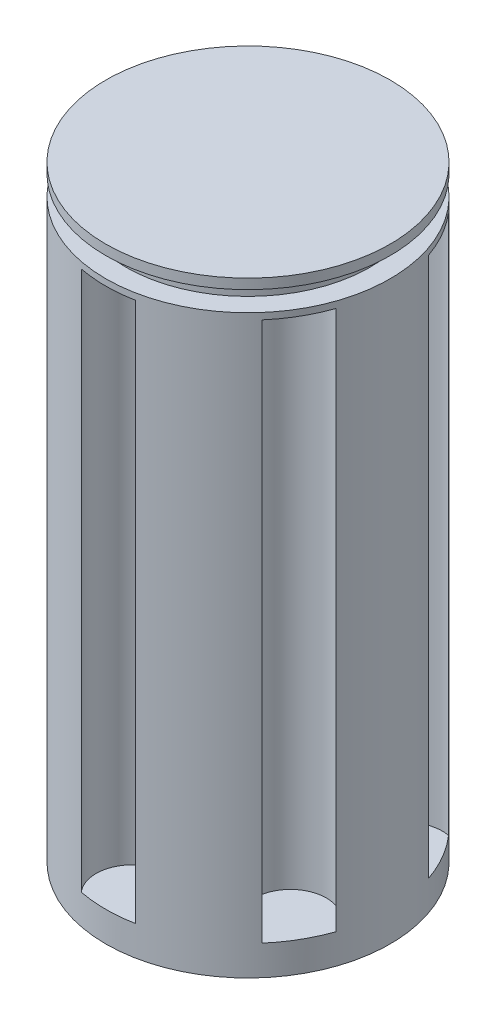
ISO-10303-21;
HEADER;
FILE_DESCRIPTION(('STEP AP214'),'2;1');
FILE_NAME('part.step','',(''),(''),'','','');
FILE_SCHEMA(('AUTOMOTIVE_DESIGN { 1 0 10303 214 1 1 1 1 }'));
ENDSEC;
DATA;
#1=APPLICATION_CONTEXT('core data for automotive mechanical design processes');
#2=APPLICATION_PROTOCOL_DEFINITION('international standard','automotive_design',2000,#1);
#3=PRODUCT_CONTEXT('',#1,'mechanical');
#4=PRODUCT('Part','Part','',(#3));
#5=PRODUCT_RELATED_PRODUCT_CATEGORY('part','',(#4));
#6=PRODUCT_DEFINITION_FORMATION('','',#4);
#7=PRODUCT_DEFINITION_CONTEXT('part definition',#1,'design');
#8=PRODUCT_DEFINITION('design','',#6,#7);
#9=PRODUCT_DEFINITION_SHAPE('','',#8);
#10=(LENGTH_UNIT() NAMED_UNIT(*) SI_UNIT(.MILLI.,.METRE.));
#11=(NAMED_UNIT(*) PLANE_ANGLE_UNIT() SI_UNIT($,.RADIAN.));
#12=(NAMED_UNIT(*) SI_UNIT($,.STERADIAN.) SOLID_ANGLE_UNIT());
#13=UNCERTAINTY_MEASURE_WITH_UNIT(LENGTH_MEASURE(1.E-05),#10,'distance_accuracy_value','');
#14=(GEOMETRIC_REPRESENTATION_CONTEXT(3) GLOBAL_UNCERTAINTY_ASSIGNED_CONTEXT((#13)) GLOBAL_UNIT_ASSIGNED_CONTEXT((#10,
#11,#12)) REPRESENTATION_CONTEXT('',''));
#15=CARTESIAN_POINT('',(0.,0.,0.));
#16=DIRECTION('',(0.,0.,1.));
#17=DIRECTION('',(1.,0.,0.));
#18=AXIS2_PLACEMENT_3D('',#15,#16,#17);
#19=CARTESIAN_POINT('',(0.,150.,0.));
#20=DIRECTION('',(0.,-1.,0.));
#21=DIRECTION('',(0.,0.,-1.));
#22=AXIS2_PLACEMENT_3D('',#19,#20,#21);
#23=CYLINDRICAL_SURFACE('',#22,35.56);
#24=CARTESIAN_POINT('',(0.,144.1,0.));
#25=DIRECTION('',(0.,-1.,0.));
#26=DIRECTION('',(0.,0.,-1.));
#27=AXIS2_PLACEMENT_3D('',#24,#25,#26);
#28=CIRCLE('',#27,35.56);
#29=CARTESIAN_POINT('',(0.,144.1,-35.56));
#30=VERTEX_POINT('',#29);
#31=EDGE_CURVE('E206',#30,#30,#28,.F.);
#32=ORIENTED_EDGE('',*,*,#31,.F.);
#33=EDGE_LOOP('',(#32));
#34=FACE_BOUND('',#33,.T.);
#35=CARTESIAN_POINT('',(0.,142.5,0.));
#36=DIRECTION('',(0.,-1.,0.));
#37=DIRECTION('',(0.,0.,-1.));
#38=AXIS2_PLACEMENT_3D('',#35,#36,#37);
#39=CIRCLE('',#38,35.56);
#40=CARTESIAN_POINT('',(33.6247815740745,142.5,11.5709837134004));
#41=VERTEX_POINT('',#40);
#42=CARTESIAN_POINT('',(26.8331566296185,142.5,23.3344231831507));
#43=VERTEX_POINT('',#42);
#44=EDGE_CURVE('E182',#41,#43,#39,.T.);
#45=ORIENTED_EDGE('',*,*,#44,.F.);
#46=DIRECTION('',(0.,-1.,0.));
#47=VECTOR('',#46,1.);
#48=CARTESIAN_POINT('',(33.6247815740745,75.,11.5709837134004));
#49=LINE('',#48,#47);
#50=CARTESIAN_POINT('',(33.6247815740745,7.5,11.5709837134004));
#51=VERTEX_POINT('',#50);
#52=EDGE_CURVE('E176',#41,#51,#49,.T.);
#53=ORIENTED_EDGE('',*,*,#52,.T.);
#54=CARTESIAN_POINT('',(0.,7.50000000000001,0.));
#55=DIRECTION('',(0.,-1.,0.));
#56=DIRECTION('',(0.,0.,-1.));
#57=AXIS2_PLACEMENT_3D('',#54,#55,#56);
#58=CIRCLE('',#57,35.56);
#59=CARTESIAN_POINT('',(26.8331566296185,7.5,23.3344231831507));
#60=VERTEX_POINT('',#59);
#61=EDGE_CURVE('E173',#51,#60,#58,.T.);
#62=ORIENTED_EDGE('',*,*,#61,.T.);
#63=DIRECTION('',(0.,-1.,0.));
#64=VECTOR('',#63,1.);
#65=CARTESIAN_POINT('',(26.8331566296184,75.,23.3344231831507));
#66=LINE('',#65,#64);
#67=EDGE_CURVE('E179',#60,#43,#66,.F.);
#68=ORIENTED_EDGE('',*,*,#67,.T.);
#69=EDGE_LOOP('',(#45,#53,#62,#68));
#70=FACE_BOUND('',#69,.T.);
#71=CARTESIAN_POINT('',(0.,142.5,0.));
#72=DIRECTION('',(0.,-1.,0.));
#73=DIRECTION('',(0.,0.,-1.));
#74=AXIS2_PLACEMENT_3D('',#71,#72,#73);
#75=CIRCLE('',#74,35.56);
#76=CARTESIAN_POINT('',(-26.8331566296181,142.5,23.3344231831511));
#77=VERTEX_POINT('',#76);
#78=CARTESIAN_POINT('',(-33.6247815740744,142.5,11.5709837134009));
#79=VERTEX_POINT('',#78);
#80=EDGE_CURVE('E160',#77,#79,#75,.T.);
#81=ORIENTED_EDGE('',*,*,#80,.F.);
#82=DIRECTION('',(0.,-1.,0.));
#83=VECTOR('',#82,1.);
#84=CARTESIAN_POINT('',(-26.8331566296181,75.,23.3344231831511));
#85=LINE('',#84,#83);
#86=CARTESIAN_POINT('',(-26.8331566296181,7.5,23.3344231831511));
#87=VERTEX_POINT('',#86);
#88=EDGE_CURVE('E154',#77,#87,#85,.T.);
#89=ORIENTED_EDGE('',*,*,#88,.T.);
#90=CARTESIAN_POINT('',(0.,7.50000000000001,0.));
#91=DIRECTION('',(0.,-1.,0.));
#92=DIRECTION('',(0.,0.,-1.));
#93=AXIS2_PLACEMENT_3D('',#90,#91,#92);
#94=CIRCLE('',#93,35.56);
#95=CARTESIAN_POINT('',(-33.6247815740744,7.5,11.5709837134009));
#96=VERTEX_POINT('',#95);
#97=EDGE_CURVE('E151',#87,#96,#94,.T.);
#98=ORIENTED_EDGE('',*,*,#97,.T.);
#99=DIRECTION('',(0.,-1.,0.));
#100=VECTOR('',#99,1.);
#101=CARTESIAN_POINT('',(-33.6247815740744,75.,11.5709837134009));
#102=LINE('',#101,#100);
#103=EDGE_CURVE('E157',#96,#79,#102,.F.);
#104=ORIENTED_EDGE('',*,*,#103,.T.);
#105=EDGE_LOOP('',(#81,#89,#98,#104));
#106=FACE_BOUND('',#105,.T.);
#107=CARTESIAN_POINT('',(0.,142.5,0.));
#108=DIRECTION('',(0.,-1.,0.));
#109=DIRECTION('',(0.,0.,-1.));
#110=AXIS2_PLACEMENT_3D('',#107,#108,#109);
#111=CIRCLE('',#110,35.56);
#112=CARTESIAN_POINT('',(-6.79162494445618,142.5,-34.9054068965517));
#113=VERTEX_POINT('',#112);
#114=CARTESIAN_POINT('',(6.79162494445618,142.5,-34.9054068965517));
#115=VERTEX_POINT('',#114);
#116=EDGE_CURVE('E133',#113,#115,#111,.T.);
#117=ORIENTED_EDGE('',*,*,#116,.F.);
#118=DIRECTION('',(0.,-1.,0.));
#119=VECTOR('',#118,1.);
#120=CARTESIAN_POINT('',(-6.79162494445619,75.,-34.9054068965517));
#121=LINE('',#120,#119);
#122=CARTESIAN_POINT('',(-6.79162494445618,7.5,-34.9054068965517));
#123=VERTEX_POINT('',#122);
#124=EDGE_CURVE('E223',#113,#123,#121,.T.);
#125=ORIENTED_EDGE('',*,*,#124,.T.);
#126=CARTESIAN_POINT('',(0.,7.50000000000001,0.));
#127=DIRECTION('',(0.,-1.,0.));
#128=DIRECTION('',(0.,0.,-1.));
#129=AXIS2_PLACEMENT_3D('',#126,#127,#128);
#130=CIRCLE('',#129,35.56);
#131=CARTESIAN_POINT('',(6.79162494445618,7.5,-34.9054068965517));
#132=VERTEX_POINT('',#131);
#133=EDGE_CURVE('E220',#123,#132,#130,.T.);
#134=ORIENTED_EDGE('',*,*,#133,.T.);
#135=DIRECTION('',(0.,-1.,0.));
#136=VECTOR('',#135,1.);
#137=CARTESIAN_POINT('',(6.79162494445619,75.,-34.9054068965517));
#138=LINE('',#137,#136);
#139=EDGE_CURVE('E226',#132,#115,#138,.F.);
#140=ORIENTED_EDGE('',*,*,#139,.T.);
#141=EDGE_LOOP('',(#117,#125,#134,#140));
#142=FACE_BOUND('',#141,.T.);
#143=CARTESIAN_POINT('',(0.,0.,0.));
#144=DIRECTION('',(0.,1.,0.));
#145=DIRECTION('',(0.,0.,-1.));
#146=AXIS2_PLACEMENT_3D('',#143,#144,#145);
#147=CIRCLE('',#146,35.56);
#148=CARTESIAN_POINT('',(0.,0.,-35.56));
#149=VERTEX_POINT('',#148);
#150=EDGE_CURVE('E215',#149,#149,#147,.T.);
#151=ORIENTED_EDGE('',*,*,#150,.T.);
#152=EDGE_LOOP('',(#151));
#153=FACE_BOUND('',#152,.T.);
#154=CARTESIAN_POINT('',(0.,142.5,0.));
#155=DIRECTION('',(0.,-1.,0.));
#156=DIRECTION('',(0.,0.,-1.));
#157=AXIS2_PLACEMENT_3D('',#154,#155,#156);
#158=CIRCLE('',#157,35.56);
#159=CARTESIAN_POINT('',(-33.6247815740744,142.5,-11.5709837134006));
#160=VERTEX_POINT('',#159);
#161=CARTESIAN_POINT('',(-26.8331566296183,142.5,-23.3344231831509));
#162=VERTEX_POINT('',#161);
#163=EDGE_CURVE('E145',#160,#162,#158,.T.);
#164=ORIENTED_EDGE('',*,*,#163,.F.);
#165=DIRECTION('',(0.,-1.,0.));
#166=VECTOR('',#165,1.);
#167=CARTESIAN_POINT('',(-33.6247815740744,75.,-11.5709837134006));
#168=LINE('',#167,#166);
#169=CARTESIAN_POINT('',(-33.6247815740744,7.5,-11.5709837134006));
#170=VERTEX_POINT('',#169);
#171=EDGE_CURVE('E132',#160,#170,#168,.T.);
#172=ORIENTED_EDGE('',*,*,#171,.T.);
#173=CARTESIAN_POINT('',(0.,7.50000000000001,0.));
#174=DIRECTION('',(0.,-1.,0.));
#175=DIRECTION('',(0.,0.,-1.));
#176=AXIS2_PLACEMENT_3D('',#173,#174,#175);
#177=CIRCLE('',#176,35.56);
#178=CARTESIAN_POINT('',(-26.8331566296183,7.5,-23.3344231831509));
#179=VERTEX_POINT('',#178);
#180=EDGE_CURVE('E124',#170,#179,#177,.T.);
#181=ORIENTED_EDGE('',*,*,#180,.T.);
#182=DIRECTION('',(0.,-1.,0.));
#183=VECTOR('',#182,1.);
#184=CARTESIAN_POINT('',(-26.8331566296183,75.,-23.3344231831509));
#185=LINE('',#184,#183);
#186=EDGE_CURVE('E139',#179,#162,#185,.F.);
#187=ORIENTED_EDGE('',*,*,#186,.T.);
#188=EDGE_LOOP('',(#164,#172,#181,#187));
#189=FACE_BOUND('',#188,.T.);
#190=CARTESIAN_POINT('',(0.,142.5,0.));
#191=DIRECTION('',(0.,-1.,0.));
#192=DIRECTION('',(0.,0.,-1.));
#193=AXIS2_PLACEMENT_3D('',#190,#191,#192);
#194=CIRCLE('',#193,35.56);
#195=CARTESIAN_POINT('',(6.79162494445618,142.5,34.9054068965517));
#196=VERTEX_POINT('',#195);
#197=CARTESIAN_POINT('',(-6.79162494445618,142.5,34.9054068965517));
#198=VERTEX_POINT('',#197);
#199=EDGE_CURVE('E171',#196,#198,#194,.T.);
#200=ORIENTED_EDGE('',*,*,#199,.F.);
#201=DIRECTION('',(0.,-1.,0.));
#202=VECTOR('',#201,1.);
#203=CARTESIAN_POINT('',(6.79162494445619,75.,34.9054068965517));
#204=LINE('',#203,#202);
#205=CARTESIAN_POINT('',(6.79162494445618,7.5,34.9054068965517));
#206=VERTEX_POINT('',#205);
#207=EDGE_CURVE('E165',#196,#206,#204,.T.);
#208=ORIENTED_EDGE('',*,*,#207,.T.);
#209=CARTESIAN_POINT('',(0.,7.50000000000001,0.));
#210=DIRECTION('',(0.,-1.,0.));
#211=DIRECTION('',(0.,0.,-1.));
#212=AXIS2_PLACEMENT_3D('',#209,#210,#211);
#213=CIRCLE('',#212,35.56);
#214=CARTESIAN_POINT('',(-6.79162494445618,7.5,34.9054068965517));
#215=VERTEX_POINT('',#214);
#216=EDGE_CURVE('E162',#206,#215,#213,.T.);
#217=ORIENTED_EDGE('',*,*,#216,.T.);
#218=DIRECTION('',(0.,-1.,0.));
#219=VECTOR('',#218,1.);
#220=CARTESIAN_POINT('',(-6.79162494445619,75.,34.9054068965517));
#221=LINE('',#220,#219);
#222=EDGE_CURVE('E168',#215,#198,#221,.F.);
#223=ORIENTED_EDGE('',*,*,#222,.T.);
#224=EDGE_LOOP('',(#200,#208,#217,#223));
#225=FACE_BOUND('',#224,.T.);
#226=CARTESIAN_POINT('',(0.,142.5,0.));
#227=DIRECTION('',(0.,-1.,0.));
#228=DIRECTION('',(0.,0.,-1.));
#229=AXIS2_PLACEMENT_3D('',#226,#227,#228);
#230=CIRCLE('',#229,35.56);
#231=CARTESIAN_POINT('',(26.833156629618,142.5,-23.3344231831513));
#232=VERTEX_POINT('',#231);
#233=CARTESIAN_POINT('',(33.6247815740743,142.5,-11.5709837134011));
#234=VERTEX_POINT('',#233);
#235=EDGE_CURVE('E43',#232,#234,#230,.T.);
#236=ORIENTED_EDGE('',*,*,#235,.F.);
#237=DIRECTION('',(0.,-1.,0.));
#238=VECTOR('',#237,1.);
#239=CARTESIAN_POINT('',(26.833156629618,75.,-23.3344231831513));
#240=LINE('',#239,#238);
#241=CARTESIAN_POINT('',(26.833156629618,7.5,-23.3344231831513));
#242=VERTEX_POINT('',#241);
#243=EDGE_CURVE('E187',#232,#242,#240,.T.);
#244=ORIENTED_EDGE('',*,*,#243,.T.);
#245=CARTESIAN_POINT('',(0.,7.50000000000001,0.));
#246=DIRECTION('',(0.,-1.,0.));
#247=DIRECTION('',(0.,0.,-1.));
#248=AXIS2_PLACEMENT_3D('',#245,#246,#247);
#249=CIRCLE('',#248,35.56);
#250=CARTESIAN_POINT('',(33.6247815740743,7.5,-11.5709837134011));
#251=VERTEX_POINT('',#250);
#252=EDGE_CURVE('E184',#242,#251,#249,.T.);
#253=ORIENTED_EDGE('',*,*,#252,.T.);
#254=DIRECTION('',(0.,-1.,0.));
#255=VECTOR('',#254,1.);
#256=CARTESIAN_POINT('',(33.6247815740743,75.,-11.5709837134011));
#257=LINE('',#256,#255);
#258=EDGE_CURVE('E190',#251,#234,#257,.F.);
#259=ORIENTED_EDGE('',*,*,#258,.T.);
#260=EDGE_LOOP('',(#236,#244,#253,#259));
#261=FACE_BOUND('',#260,.T.);
#262=ADVANCED_FACE('F35',(#34,#70,#106,#142,#153,#189,#225,#261),#23,.T.);
#263=CARTESIAN_POINT('',(0.,0.,0.));
#264=DIRECTION('',(0.,1.,0.));
#265=DIRECTION('',(0.,0.,1.));
#266=AXIS2_PLACEMENT_3D('',#263,#264,#265);
#267=PLANE('',#266);
#268=CARTESIAN_POINT('',(0.,0.,0.));
#269=DIRECTION('',(0.,-1.,0.));
#270=DIRECTION('',(0.,0.,-1.));
#271=AXIS2_PLACEMENT_3D('',#268,#269,#270);
#272=CIRCLE('',#271,19.05);
#273=CARTESIAN_POINT('',(0.,0.,-19.05));
#274=VERTEX_POINT('',#273);
#275=EDGE_CURVE('E203',#274,#274,#272,.T.);
#276=ORIENTED_EDGE('',*,*,#275,.F.);
#277=EDGE_LOOP('',(#276));
#278=FACE_BOUND('',#277,.T.);
#279=ORIENTED_EDGE('',*,*,#150,.F.);
#280=EDGE_LOOP('',(#279));
#281=FACE_BOUND('',#280,.T.);
#282=ADVANCED_FACE('F250',(#278,#281),#267,.F.);
#283=CARTESIAN_POINT('',(0.,142.5,-29.));
#284=DIRECTION('',(0.,-1.,0.));
#285=DIRECTION('',(0.,0.,-1.));
#286=AXIS2_PLACEMENT_3D('',#283,#284,#285);
#287=CYLINDRICAL_SURFACE('',#286,9.);
#288=CARTESIAN_POINT('',(0.,7.5,-29.));
#289=DIRECTION('',(0.,-1.,0.));
#290=DIRECTION('',(0.,0.,-1.));
#291=AXIS2_PLACEMENT_3D('',#288,#289,#290);
#292=CIRCLE('',#291,9.);
#293=EDGE_CURVE('E210',#132,#123,#292,.T.);
#294=ORIENTED_EDGE('',*,*,#293,.T.);
#295=ORIENTED_EDGE('',*,*,#124,.F.);
#296=CARTESIAN_POINT('',(0.,142.5,-29.));
#297=DIRECTION('',(0.,-1.,0.));
#298=DIRECTION('',(0.,0.,-1.));
#299=AXIS2_PLACEMENT_3D('',#296,#297,#298);
#300=CIRCLE('',#299,9.);
#301=EDGE_CURVE('E212',#115,#113,#300,.T.);
#302=ORIENTED_EDGE('',*,*,#301,.F.);
#303=ORIENTED_EDGE('',*,*,#139,.F.);
#304=EDGE_LOOP('',(#294,#295,#302,#303));
#305=FACE_BOUND('',#304,.T.);
#306=ADVANCED_FACE('F235',(#305),#287,.F.);
#307=CARTESIAN_POINT('',(0.,142.5,-29.));
#308=DIRECTION('',(0.,-1.,0.));
#309=DIRECTION('',(0.,0.,-1.));
#310=AXIS2_PLACEMENT_3D('',#307,#308,#309);
#311=PLANE('',#310);
#312=ORIENTED_EDGE('',*,*,#116,.T.);
#313=ORIENTED_EDGE('',*,*,#301,.T.);
#314=EDGE_LOOP('',(#312,#313));
#315=FACE_BOUND('',#314,.T.);
#316=ADVANCED_FACE('F231',(#315),#311,.T.);
#317=CARTESIAN_POINT('',(0.,7.5,-29.));
#318=DIRECTION('',(0.,-1.,0.));
#319=DIRECTION('',(0.,0.,-1.));
#320=AXIS2_PLACEMENT_3D('',#317,#318,#319);
#321=PLANE('',#320);
#322=ORIENTED_EDGE('',*,*,#293,.F.);
#323=ORIENTED_EDGE('',*,*,#133,.F.);
#324=EDGE_LOOP('',(#322,#323));
#325=FACE_BOUND('',#324,.T.);
#326=ADVANCED_FACE('F238',(#325),#321,.F.);
#327=CARTESIAN_POINT('',(-25.1147367097488,142.5,-14.4999999999999));
#328=DIRECTION('',(0.,-1.,0.));
#329=DIRECTION('',(0.,0.,-1.));
#330=AXIS2_PLACEMENT_3D('',#327,#328,#329);
#331=CYLINDRICAL_SURFACE('',#330,9.);
#332=CARTESIAN_POINT('',(-25.1147367097488,7.5,-14.4999999999999));
#333=DIRECTION('',(0.,-1.,0.));
#334=DIRECTION('',(-0.86602540378444,0.,-0.499999999999998));
#335=AXIS2_PLACEMENT_3D('',#332,#333,#334);
#336=CIRCLE('',#335,9.);
#337=EDGE_CURVE('E127',#179,#170,#336,.T.);
#338=ORIENTED_EDGE('',*,*,#337,.T.);
#339=ORIENTED_EDGE('',*,*,#171,.F.);
#340=CARTESIAN_POINT('',(-25.1147367097488,142.5,-14.4999999999999));
#341=DIRECTION('',(0.,-1.,0.));
#342=DIRECTION('',(-0.86602540378444,0.,-0.499999999999998));
#343=AXIS2_PLACEMENT_3D('',#340,#341,#342);
#344=CIRCLE('',#343,9.);
#345=EDGE_CURVE('E140',#162,#160,#344,.T.);
#346=ORIENTED_EDGE('',*,*,#345,.F.);
#347=ORIENTED_EDGE('',*,*,#186,.F.);
#348=EDGE_LOOP('',(#338,#339,#346,#347));
#349=FACE_BOUND('',#348,.T.);
#350=ADVANCED_FACE('F136',(#349),#331,.F.);
#351=CARTESIAN_POINT('',(-25.1147367097488,142.5,-14.4999999999999));
#352=DIRECTION('',(0.,-1.,0.));
#353=DIRECTION('',(-0.86602540378444,0.,-0.499999999999998));
#354=AXIS2_PLACEMENT_3D('',#351,#352,#353);
#355=PLANE('',#354);
#356=ORIENTED_EDGE('',*,*,#163,.T.);
#357=ORIENTED_EDGE('',*,*,#345,.T.);
#358=EDGE_LOOP('',(#356,#357));
#359=FACE_BOUND('',#358,.T.);
#360=ADVANCED_FACE('F245',(#359),#355,.T.);
#361=CARTESIAN_POINT('',(-25.1147367097488,7.5,-14.4999999999999));
#362=DIRECTION('',(0.,-1.,0.));
#363=DIRECTION('',(-0.86602540378444,0.,-0.499999999999998));
#364=AXIS2_PLACEMENT_3D('',#361,#362,#363);
#365=PLANE('',#364);
#366=ORIENTED_EDGE('',*,*,#337,.F.);
#367=ORIENTED_EDGE('',*,*,#180,.F.);
#368=EDGE_LOOP('',(#366,#367));
#369=FACE_BOUND('',#368,.T.);
#370=ADVANCED_FACE('F126',(#369),#365,.F.);
#371=CARTESIAN_POINT('',(-25.1147367097487,142.5,14.5000000000001));
#372=DIRECTION('',(0.,-1.,0.));
#373=DIRECTION('',(0.,0.,-1.));
#374=AXIS2_PLACEMENT_3D('',#371,#372,#373);
#375=CYLINDRICAL_SURFACE('',#374,9.);
#376=CARTESIAN_POINT('',(-25.1147367097487,7.5,14.5000000000001));
#377=DIRECTION('',(0.,-1.,0.));
#378=DIRECTION('',(-0.866025403784436,0.,0.500000000000004));
#379=AXIS2_PLACEMENT_3D('',#376,#377,#378);
#380=CIRCLE('',#379,9.);
#381=EDGE_CURVE('E270',#96,#87,#380,.T.);
#382=ORIENTED_EDGE('',*,*,#381,.T.);
#383=ORIENTED_EDGE('',*,*,#88,.F.);
#384=CARTESIAN_POINT('',(-25.1147367097487,142.5,14.5000000000001));
#385=DIRECTION('',(0.,-1.,0.));
#386=DIRECTION('',(-0.866025403784436,0.,0.500000000000004));
#387=AXIS2_PLACEMENT_3D('',#384,#385,#386);
#388=CIRCLE('',#387,9.);
#389=EDGE_CURVE('E141',#79,#77,#388,.T.);
#390=ORIENTED_EDGE('',*,*,#389,.F.);
#391=ORIENTED_EDGE('',*,*,#103,.F.);
#392=EDGE_LOOP('',(#382,#383,#390,#391));
#393=FACE_BOUND('',#392,.T.);
#394=ADVANCED_FACE('F269',(#393),#375,.F.);
#395=CARTESIAN_POINT('',(-25.1147367097487,142.5,14.5000000000001));
#396=DIRECTION('',(0.,-1.,0.));
#397=DIRECTION('',(-0.866025403784436,0.,0.500000000000004));
#398=AXIS2_PLACEMENT_3D('',#395,#396,#397);
#399=PLANE('',#398);
#400=ORIENTED_EDGE('',*,*,#80,.T.);
#401=ORIENTED_EDGE('',*,*,#389,.T.);
#402=EDGE_LOOP('',(#400,#401));
#403=FACE_BOUND('',#402,.T.);
#404=ADVANCED_FACE('F266',(#403),#399,.T.);
#405=CARTESIAN_POINT('',(-25.1147367097487,7.5,14.5000000000001));
#406=DIRECTION('',(0.,-1.,0.));
#407=DIRECTION('',(-0.866025403784436,0.,0.500000000000004));
#408=AXIS2_PLACEMENT_3D('',#405,#406,#407);
#409=PLANE('',#408);
#410=ORIENTED_EDGE('',*,*,#381,.F.);
#411=ORIENTED_EDGE('',*,*,#97,.F.);
#412=EDGE_LOOP('',(#410,#411));
#413=FACE_BOUND('',#412,.T.);
#414=ADVANCED_FACE('F318',(#413),#409,.F.);
#415=CARTESIAN_POINT('',(0.,142.5,29.));
#416=DIRECTION('',(0.,-1.,0.));
#417=DIRECTION('',(0.,0.,-1.));
#418=AXIS2_PLACEMENT_3D('',#415,#416,#417);
#419=CYLINDRICAL_SURFACE('',#418,9.);
#420=CARTESIAN_POINT('',(0.,7.5,29.));
#421=DIRECTION('',(0.,-1.,0.));
#422=DIRECTION('',(0.,0.,1.));
#423=AXIS2_PLACEMENT_3D('',#420,#421,#422);
#424=CIRCLE('',#423,9.);
#425=EDGE_CURVE('E278',#215,#206,#424,.T.);
#426=ORIENTED_EDGE('',*,*,#425,.T.);
#427=ORIENTED_EDGE('',*,*,#207,.F.);
#428=CARTESIAN_POINT('',(0.,142.5,29.));
#429=DIRECTION('',(0.,-1.,0.));
#430=DIRECTION('',(0.,0.,1.));
#431=AXIS2_PLACEMENT_3D('',#428,#429,#430);
#432=CIRCLE('',#431,9.);
#433=EDGE_CURVE('E272',#198,#196,#432,.T.);
#434=ORIENTED_EDGE('',*,*,#433,.F.);
#435=ORIENTED_EDGE('',*,*,#222,.F.);
#436=EDGE_LOOP('',(#426,#427,#434,#435));
#437=FACE_BOUND('',#436,.T.);
#438=ADVANCED_FACE('F325',(#437),#419,.F.);
#439=CARTESIAN_POINT('',(0.,142.5,29.));
#440=DIRECTION('',(0.,-1.,0.));
#441=DIRECTION('',(0.,0.,1.));
#442=AXIS2_PLACEMENT_3D('',#439,#440,#441);
#443=PLANE('',#442);
#444=ORIENTED_EDGE('',*,*,#199,.T.);
#445=ORIENTED_EDGE('',*,*,#433,.T.);
#446=EDGE_LOOP('',(#444,#445));
#447=FACE_BOUND('',#446,.T.);
#448=ADVANCED_FACE('F322',(#447),#443,.T.);
#449=CARTESIAN_POINT('',(0.,7.5,29.));
#450=DIRECTION('',(0.,-1.,0.));
#451=DIRECTION('',(0.,0.,1.));
#452=AXIS2_PLACEMENT_3D('',#449,#450,#451);
#453=PLANE('',#452);
#454=ORIENTED_EDGE('',*,*,#425,.F.);
#455=ORIENTED_EDGE('',*,*,#216,.F.);
#456=EDGE_LOOP('',(#454,#455));
#457=FACE_BOUND('',#456,.T.);
#458=ADVANCED_FACE('F301',(#457),#453,.F.);
#459=CARTESIAN_POINT('',(25.1147367097489,142.5,14.4999999999998));
#460=DIRECTION('',(0.,-1.,0.));
#461=DIRECTION('',(0.,0.,-1.));
#462=AXIS2_PLACEMENT_3D('',#459,#460,#461);
#463=CYLINDRICAL_SURFACE('',#462,9.);
#464=CARTESIAN_POINT('',(25.1147367097489,7.5,14.4999999999998));
#465=DIRECTION('',(0.,-1.,0.));
#466=DIRECTION('',(0.866025403784443,0.,0.499999999999992));
#467=AXIS2_PLACEMENT_3D('',#464,#465,#466);
#468=CIRCLE('',#467,9.);
#469=EDGE_CURVE('E57',#60,#51,#468,.T.);
#470=ORIENTED_EDGE('',*,*,#469,.T.);
#471=ORIENTED_EDGE('',*,*,#52,.F.);
#472=CARTESIAN_POINT('',(25.1147367097489,142.5,14.4999999999998));
#473=DIRECTION('',(0.,-1.,0.));
#474=DIRECTION('',(0.866025403784443,0.,0.499999999999992));
#475=AXIS2_PLACEMENT_3D('',#472,#473,#474);
#476=CIRCLE('',#475,9.);
#477=EDGE_CURVE('E281',#43,#41,#476,.T.);
#478=ORIENTED_EDGE('',*,*,#477,.F.);
#479=ORIENTED_EDGE('',*,*,#67,.F.);
#480=EDGE_LOOP('',(#470,#471,#478,#479));
#481=FACE_BOUND('',#480,.T.);
#482=ADVANCED_FACE('F284',(#481),#463,.F.);
#483=CARTESIAN_POINT('',(25.1147367097489,142.5,14.4999999999998));
#484=DIRECTION('',(0.,-1.,0.));
#485=DIRECTION('',(0.866025403784443,0.,0.499999999999992));
#486=AXIS2_PLACEMENT_3D('',#483,#484,#485);
#487=PLANE('',#486);
#488=ORIENTED_EDGE('',*,*,#44,.T.);
#489=ORIENTED_EDGE('',*,*,#477,.T.);
#490=EDGE_LOOP('',(#488,#489));
#491=FACE_BOUND('',#490,.T.);
#492=ADVANCED_FACE('F288',(#491),#487,.T.);
#493=CARTESIAN_POINT('',(25.1147367097489,7.5,14.4999999999998));
#494=DIRECTION('',(0.,-1.,0.));
#495=DIRECTION('',(0.866025403784443,0.,0.499999999999992));
#496=AXIS2_PLACEMENT_3D('',#493,#494,#495);
#497=PLANE('',#496);
#498=ORIENTED_EDGE('',*,*,#469,.F.);
#499=ORIENTED_EDGE('',*,*,#61,.F.);
#500=EDGE_LOOP('',(#498,#499));
#501=FACE_BOUND('',#500,.T.);
#502=ADVANCED_FACE('F286',(#501),#497,.F.);
#503=CARTESIAN_POINT('',(25.1147367097485,142.5,-14.5000000000003));
#504=DIRECTION('',(0.,-1.,0.));
#505=DIRECTION('',(0.,0.,-1.));
#506=AXIS2_PLACEMENT_3D('',#503,#504,#505);
#507=CYLINDRICAL_SURFACE('',#506,9.);
#508=CARTESIAN_POINT('',(25.1147367097485,7.5,-14.5000000000003));
#509=DIRECTION('',(0.,-1.,0.));
#510=DIRECTION('',(0.866025403784433,0.,-0.50000000000001));
#511=AXIS2_PLACEMENT_3D('',#508,#509,#510);
#512=CIRCLE('',#511,9.);
#513=EDGE_CURVE('E50',#251,#242,#512,.T.);
#514=ORIENTED_EDGE('',*,*,#513,.T.);
#515=ORIENTED_EDGE('',*,*,#243,.F.);
#516=CARTESIAN_POINT('',(25.1147367097485,142.5,-14.5000000000003));
#517=DIRECTION('',(0.,-1.,0.));
#518=DIRECTION('',(0.866025403784433,0.,-0.50000000000001));
#519=AXIS2_PLACEMENT_3D('',#516,#517,#518);
#520=CIRCLE('',#519,9.);
#521=EDGE_CURVE('E197',#234,#232,#520,.T.);
#522=ORIENTED_EDGE('',*,*,#521,.F.);
#523=ORIENTED_EDGE('',*,*,#258,.F.);
#524=EDGE_LOOP('',(#514,#515,#522,#523));
#525=FACE_BOUND('',#524,.T.);
#526=ADVANCED_FACE('F200',(#525),#507,.F.);
#527=CARTESIAN_POINT('',(25.1147367097485,142.5,-14.5000000000003));
#528=DIRECTION('',(0.,-1.,0.));
#529=DIRECTION('',(0.866025403784433,0.,-0.50000000000001));
#530=AXIS2_PLACEMENT_3D('',#527,#528,#529);
#531=PLANE('',#530);
#532=ORIENTED_EDGE('',*,*,#235,.T.);
#533=ORIENTED_EDGE('',*,*,#521,.T.);
#534=EDGE_LOOP('',(#532,#533));
#535=FACE_BOUND('',#534,.T.);
#536=ADVANCED_FACE('F196',(#535),#531,.T.);
#537=CARTESIAN_POINT('',(25.1147367097485,7.5,-14.5000000000003));
#538=DIRECTION('',(0.,-1.,0.));
#539=DIRECTION('',(0.866025403784433,0.,-0.50000000000001));
#540=AXIS2_PLACEMENT_3D('',#537,#538,#539);
#541=PLANE('',#540);
#542=ORIENTED_EDGE('',*,*,#513,.F.);
#543=ORIENTED_EDGE('',*,*,#252,.F.);
#544=EDGE_LOOP('',(#542,#543));
#545=FACE_BOUND('',#544,.T.);
#546=ADVANCED_FACE('F202',(#545),#541,.F.);
#547=CARTESIAN_POINT('',(0.,150.,0.));
#548=DIRECTION('',(0.,-1.,0.));
#549=DIRECTION('',(0.,0.,-1.));
#550=AXIS2_PLACEMENT_3D('',#547,#548,#549);
#551=CYLINDRICAL_SURFACE('',#550,19.05);
#552=CARTESIAN_POINT('',(0.,144.1,0.));
#553=DIRECTION('',(0.,-1.,0.));
#554=DIRECTION('',(0.,0.,-1.));
#555=AXIS2_PLACEMENT_3D('',#552,#553,#554);
#556=CIRCLE('',#555,19.05);
#557=CARTESIAN_POINT('',(0.,144.1,-19.05));
#558=VERTEX_POINT('',#557);
#559=EDGE_CURVE('E38',#558,#558,#556,.F.);
#560=ORIENTED_EDGE('',*,*,#559,.T.);
#561=EDGE_LOOP('',(#560));
#562=FACE_BOUND('',#561,.T.);
#563=ORIENTED_EDGE('',*,*,#275,.T.);
#564=EDGE_LOOP('',(#563));
#565=FACE_BOUND('',#564,.T.);
#566=ADVANCED_FACE('F305',(#562,#565),#551,.F.);
#567=CARTESIAN_POINT('',(-25.1147367097488,144.1,-14.4999999999999));
#568=DIRECTION('',(0.,-1.,0.));
#569=DIRECTION('',(-0.86602540378444,0.,-0.499999999999998));
#570=AXIS2_PLACEMENT_3D('',#567,#568,#569);
#571=PLANE('',#570);
#572=CARTESIAN_POINT('',(0.,144.1,0.));
#573=DIRECTION('',(0.,1.,0.));
#574=DIRECTION('',(0.,0.,1.));
#575=AXIS2_PLACEMENT_3D('',#572,#573,#574);
#576=CIRCLE('',#575,30.56);
#577=CARTESIAN_POINT('',(0.,144.1,30.56));
#578=VERTEX_POINT('',#577);
#579=EDGE_CURVE('E12',#578,#578,#576,.T.);
#580=ORIENTED_EDGE('',*,*,#579,.F.);
#581=EDGE_LOOP('',(#580));
#582=FACE_BOUND('',#581,.T.);
#583=ORIENTED_EDGE('',*,*,#31,.T.);
#584=EDGE_LOOP('',(#583));
#585=FACE_BOUND('',#584,.T.);
#586=ADVANCED_FACE('F405',(#582,#585),#571,.F.);
#587=CARTESIAN_POINT('',(0.,149.1,0.));
#588=DIRECTION('',(0.,-1.,0.));
#589=DIRECTION('',(0.,0.,-1.));
#590=AXIS2_PLACEMENT_3D('',#587,#588,#589);
#591=CYLINDRICAL_SURFACE('',#590,30.56);
#592=CARTESIAN_POINT('',(0.,149.1,0.));
#593=DIRECTION('',(0.,1.,0.));
#594=DIRECTION('',(0.,0.,1.));
#595=AXIS2_PLACEMENT_3D('',#592,#593,#594);
#596=CIRCLE('',#595,30.56);
#597=CARTESIAN_POINT('',(0.,149.1,30.56));
#598=VERTEX_POINT('',#597);
#599=EDGE_CURVE('E472',#598,#598,#596,.T.);
#600=ORIENTED_EDGE('',*,*,#599,.F.);
#601=EDGE_LOOP('',(#600));
#602=FACE_BOUND('',#601,.T.);
#603=ORIENTED_EDGE('',*,*,#579,.T.);
#604=EDGE_LOOP('',(#603));
#605=FACE_BOUND('',#604,.T.);
#606=ADVANCED_FACE('F415',(#602,#605),#591,.T.);
#607=CARTESIAN_POINT('',(0.,144.1,0.));
#608=DIRECTION('',(0.,1.,0.));
#609=DIRECTION('',(0.,0.,1.));
#610=AXIS2_PLACEMENT_3D('',#607,#608,#609);
#611=PLANE('',#610);
#612=ORIENTED_EDGE('',*,*,#559,.F.);
#613=EDGE_LOOP('',(#612));
#614=FACE_BOUND('',#613,.T.);
#615=ADVANCED_FACE('F425',(#614),#611,.F.);
#616=CARTESIAN_POINT('',(0.,151.6,0.));
#617=DIRECTION('',(0.,-1.,0.));
#618=DIRECTION('',(0.,0.,-1.));
#619=AXIS2_PLACEMENT_3D('',#616,#617,#618);
#620=CYLINDRICAL_SURFACE('',#619,35.56);
#621=CARTESIAN_POINT('',(0.,151.6,0.));
#622=DIRECTION('',(0.,1.,0.));
#623=DIRECTION('',(0.,0.,1.));
#624=AXIS2_PLACEMENT_3D('',#621,#622,#623);
#625=CIRCLE('',#624,35.56);
#626=CARTESIAN_POINT('',(0.,151.6,35.56));
#627=VERTEX_POINT('',#626);
#628=EDGE_CURVE('E477',#627,#627,#625,.T.);
#629=ORIENTED_EDGE('',*,*,#628,.F.);
#630=EDGE_LOOP('',(#629));
#631=FACE_BOUND('',#630,.T.);
#632=CARTESIAN_POINT('',(0.,149.1,0.));
#633=DIRECTION('',(0.,1.,0.));
#634=DIRECTION('',(0.,0.,1.));
#635=AXIS2_PLACEMENT_3D('',#632,#633,#634);
#636=CIRCLE('',#635,35.56);
#637=CARTESIAN_POINT('',(0.,149.1,35.56));
#638=VERTEX_POINT('',#637);
#639=EDGE_CURVE('E475',#638,#638,#636,.T.);
#640=ORIENTED_EDGE('',*,*,#639,.T.);
#641=EDGE_LOOP('',(#640));
#642=FACE_BOUND('',#641,.T.);
#643=ADVANCED_FACE('F435',(#631,#642),#620,.T.);
#644=CARTESIAN_POINT('',(0.,151.6,0.));
#645=DIRECTION('',(0.,1.,0.));
#646=DIRECTION('',(0.,0.,1.));
#647=AXIS2_PLACEMENT_3D('',#644,#645,#646);
#648=PLANE('',#647);
#649=ORIENTED_EDGE('',*,*,#628,.T.);
#650=EDGE_LOOP('',(#649));
#651=FACE_BOUND('',#650,.T.);
#652=ADVANCED_FACE('F445',(#651),#648,.T.);
#653=CARTESIAN_POINT('',(0.,149.1,0.));
#654=DIRECTION('',(0.,1.,0.));
#655=DIRECTION('',(0.,0.,1.));
#656=AXIS2_PLACEMENT_3D('',#653,#654,#655);
#657=PLANE('',#656);
#658=ORIENTED_EDGE('',*,*,#599,.T.);
#659=EDGE_LOOP('',(#658));
#660=FACE_BOUND('',#659,.T.);
#661=ORIENTED_EDGE('',*,*,#639,.F.);
#662=EDGE_LOOP('',(#661));
#663=FACE_BOUND('',#662,.T.);
#664=ADVANCED_FACE('F455',(#660,#663),#657,.F.);
#665=CLOSED_SHELL('',(#262,#282,#306,#316,#326,#350,#360,#370,#394,#404,#414,#438,#448,#458,
#482,#492,#502,#526,#536,#546,#566,#586,#606,#615,#643,#652,#664));
#666=MANIFOLD_SOLID_BREP('B2',#665);
#667=ADVANCED_BREP_SHAPE_REPRESENTATION('',(#18,#666),#14);
#668=SHAPE_DEFINITION_REPRESENTATION(#9,#667);
ENDSEC;
END-ISO-10303-21;
